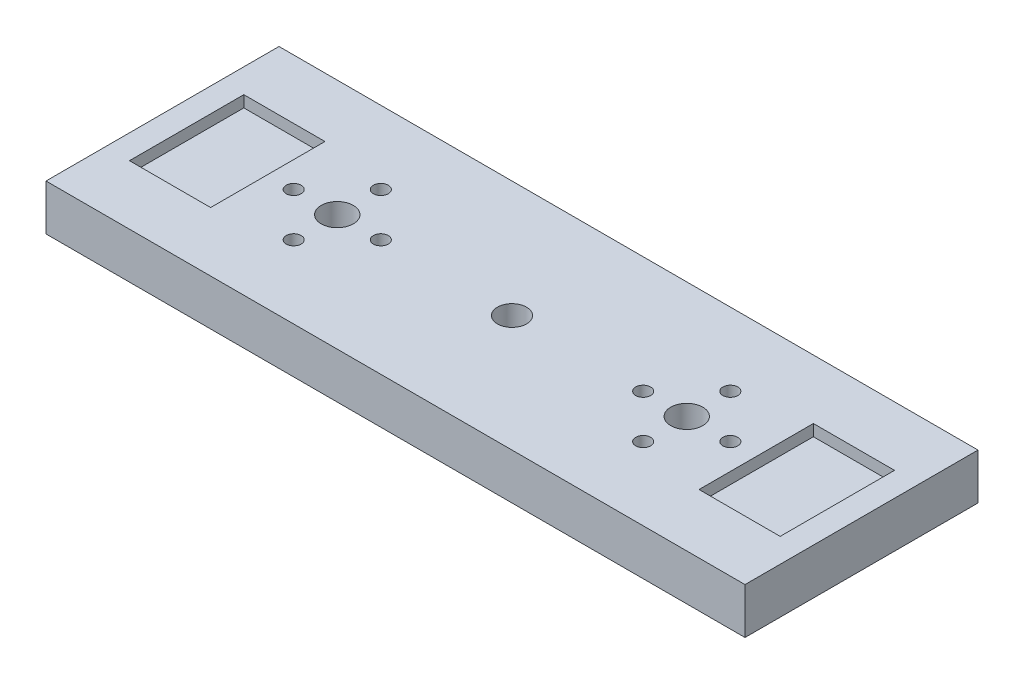
ISO-10303-21;
HEADER;
FILE_DESCRIPTION(('STEP AP214'),'2;1');
FILE_NAME('part.step','',(''),(''),'','','');
FILE_SCHEMA(('AUTOMOTIVE_DESIGN { 1 0 10303 214 1 1 1 1 }'));
ENDSEC;
DATA;
#1=APPLICATION_CONTEXT('core data for automotive mechanical design processes');
#2=APPLICATION_PROTOCOL_DEFINITION('international standard','automotive_design',2000,#1);
#3=PRODUCT_CONTEXT('',#1,'mechanical');
#4=PRODUCT('Part','Part','',(#3));
#5=PRODUCT_RELATED_PRODUCT_CATEGORY('part','',(#4));
#6=PRODUCT_DEFINITION_FORMATION('','',#4);
#7=PRODUCT_DEFINITION_CONTEXT('part definition',#1,'design');
#8=PRODUCT_DEFINITION('design','',#6,#7);
#9=PRODUCT_DEFINITION_SHAPE('','',#8);
#10=(LENGTH_UNIT() NAMED_UNIT(*) SI_UNIT(.MILLI.,.METRE.));
#11=(NAMED_UNIT(*) PLANE_ANGLE_UNIT() SI_UNIT($,.RADIAN.));
#12=(NAMED_UNIT(*) SI_UNIT($,.STERADIAN.) SOLID_ANGLE_UNIT());
#13=UNCERTAINTY_MEASURE_WITH_UNIT(LENGTH_MEASURE(1.E-05),#10,'distance_accuracy_value','');
#14=(GEOMETRIC_REPRESENTATION_CONTEXT(3) GLOBAL_UNCERTAINTY_ASSIGNED_CONTEXT((#13)) GLOBAL_UNIT_ASSIGNED_CONTEXT((#10,
#11,#12)) REPRESENTATION_CONTEXT('',''));
#15=CARTESIAN_POINT('',(0.,0.,0.));
#16=DIRECTION('',(0.,0.,1.));
#17=DIRECTION('',(1.,0.,0.));
#18=AXIS2_PLACEMENT_3D('',#15,#16,#17);
#19=CARTESIAN_POINT('',(0.,20.,0.));
#20=DIRECTION('',(0.,-1.,0.));
#21=DIRECTION('',(0.,0.,-1.));
#22=AXIS2_PLACEMENT_3D('',#19,#20,#21);
#23=PLANE('',#22);
#24=DIRECTION('',(-1.,0.,0.));
#25=VECTOR('',#24,1.);
#26=CARTESIAN_POINT('',(-141.872747828416,20.,-24.9322856161047));
#27=LINE('',#26,#25);
#28=CARTESIAN_POINT('',(-106.484987599106,20.,-24.9322856161047));
#29=VERTEX_POINT('',#28);
#30=CARTESIAN_POINT('',(-141.872747828416,20.,-24.9322856161047));
#31=VERTEX_POINT('',#30);
#32=EDGE_CURVE('E177',#29,#31,#27,.T.);
#33=ORIENTED_EDGE('',*,*,#32,.F.);
#34=DIRECTION('',(0.,0.,-1.));
#35=VECTOR('',#34,1.);
#36=CARTESIAN_POINT('',(-106.484987599106,20.,-24.9322856161047));
#37=LINE('',#36,#35);
#38=CARTESIAN_POINT('',(-106.484987599106,20.,24.9322856161047));
#39=VERTEX_POINT('',#38);
#40=EDGE_CURVE('E68',#39,#29,#37,.T.);
#41=ORIENTED_EDGE('',*,*,#40,.F.);
#42=DIRECTION('',(1.,0.,0.));
#43=VECTOR('',#42,1.);
#44=CARTESIAN_POINT('',(-141.872747828416,20.,24.9322856161047));
#45=LINE('',#44,#43);
#46=CARTESIAN_POINT('',(-141.872747828416,20.,24.9322856161047));
#47=VERTEX_POINT('',#46);
#48=EDGE_CURVE('E165',#47,#39,#45,.T.);
#49=ORIENTED_EDGE('',*,*,#48,.F.);
#50=DIRECTION('',(0.,0.,1.));
#51=VECTOR('',#50,1.);
#52=CARTESIAN_POINT('',(-141.872747828416,20.,-24.9322856161047));
#53=LINE('',#52,#51);
#54=EDGE_CURVE('E169',#31,#47,#53,.T.);
#55=ORIENTED_EDGE('',*,*,#54,.F.);
#56=EDGE_LOOP('',(#33,#41,#49,#55));
#57=FACE_BOUND('',#56,.T.);
#58=DIRECTION('',(0.,0.,1.));
#59=VECTOR('',#58,1.);
#60=CARTESIAN_POINT('',(106.484987599106,20.,-24.9322856161047));
#61=LINE('',#60,#59);
#62=CARTESIAN_POINT('',(106.484987599106,20.,-24.9322856161047));
#63=VERTEX_POINT('',#62);
#64=CARTESIAN_POINT('',(106.484987599106,20.,24.9322856161047));
#65=VERTEX_POINT('',#64);
#66=EDGE_CURVE('E215',#63,#65,#61,.T.);
#67=ORIENTED_EDGE('',*,*,#66,.F.);
#68=DIRECTION('',(-1.,0.,0.));
#69=VECTOR('',#68,1.);
#70=CARTESIAN_POINT('',(141.872747828416,20.,-24.9322856161047));
#71=LINE('',#70,#69);
#72=CARTESIAN_POINT('',(141.872747828416,20.,-24.9322856161047));
#73=VERTEX_POINT('',#72);
#74=EDGE_CURVE('E76',#73,#63,#71,.T.);
#75=ORIENTED_EDGE('',*,*,#74,.F.);
#76=DIRECTION('',(0.,0.,-1.));
#77=VECTOR('',#76,1.);
#78=CARTESIAN_POINT('',(141.872747828416,20.,-24.9322856161047));
#79=LINE('',#78,#77);
#80=CARTESIAN_POINT('',(141.872747828416,20.,24.9322856161047));
#81=VERTEX_POINT('',#80);
#82=EDGE_CURVE('E206',#81,#73,#79,.T.);
#83=ORIENTED_EDGE('',*,*,#82,.F.);
#84=DIRECTION('',(1.,0.,0.));
#85=VECTOR('',#84,1.);
#86=CARTESIAN_POINT('',(141.872747828416,20.,24.9322856161047));
#87=LINE('',#86,#85);
#88=EDGE_CURVE('E210',#65,#81,#87,.T.);
#89=ORIENTED_EDGE('',*,*,#88,.F.);
#90=EDGE_LOOP('',(#67,#75,#83,#89));
#91=FACE_BOUND('',#90,.T.);
#92=CARTESIAN_POINT('',(76.2,20.,-19.));
#93=DIRECTION('',(0.,1.,0.));
#94=DIRECTION('',(0.,0.,1.));
#95=AXIS2_PLACEMENT_3D('',#92,#93,#94);
#96=CIRCLE('',#95,3.25000000000001);
#97=CARTESIAN_POINT('',(76.2,20.,-15.75));
#98=VERTEX_POINT('',#97);
#99=EDGE_CURVE('E241',#98,#98,#96,.T.);
#100=ORIENTED_EDGE('',*,*,#99,.F.);
#101=EDGE_LOOP('',(#100));
#102=FACE_BOUND('',#101,.T.);
#103=CARTESIAN_POINT('',(57.2,20.,0.));
#104=DIRECTION('',(0.,1.,0.));
#105=DIRECTION('',(1.,0.,0.));
#106=AXIS2_PLACEMENT_3D('',#103,#104,#105);
#107=CIRCLE('',#106,3.25000000000001);
#108=CARTESIAN_POINT('',(60.45,20.,0.));
#109=VERTEX_POINT('',#108);
#110=EDGE_CURVE('E667',#109,#109,#107,.T.);
#111=ORIENTED_EDGE('',*,*,#110,.F.);
#112=EDGE_LOOP('',(#111));
#113=FACE_BOUND('',#112,.T.);
#114=CARTESIAN_POINT('',(76.2,20.,19.));
#115=DIRECTION('',(0.,1.,0.));
#116=DIRECTION('',(0.,0.,-1.));
#117=AXIS2_PLACEMENT_3D('',#114,#115,#116);
#118=CIRCLE('',#117,3.25000000000001);
#119=CARTESIAN_POINT('',(76.2,20.,15.75));
#120=VERTEX_POINT('',#119);
#121=EDGE_CURVE('E671',#120,#120,#118,.T.);
#122=ORIENTED_EDGE('',*,*,#121,.F.);
#123=EDGE_LOOP('',(#122));
#124=FACE_BOUND('',#123,.T.);
#125=CARTESIAN_POINT('',(95.2,20.,-2.35922392732846E-13));
#126=DIRECTION('',(0.,1.,0.));
#127=DIRECTION('',(-1.,0.,0.));
#128=AXIS2_PLACEMENT_3D('',#125,#126,#127);
#129=CIRCLE('',#128,3.25000000000001);
#130=CARTESIAN_POINT('',(91.95,20.,-2.01880449679125E-13));
#131=VERTEX_POINT('',#130);
#132=EDGE_CURVE('E187',#131,#131,#129,.T.);
#133=ORIENTED_EDGE('',*,*,#132,.F.);
#134=EDGE_LOOP('',(#133));
#135=FACE_BOUND('',#134,.T.);
#136=CARTESIAN_POINT('',(-95.2,20.,0.));
#137=DIRECTION('',(0.,1.,0.));
#138=DIRECTION('',(1.,0.,0.));
#139=AXIS2_PLACEMENT_3D('',#136,#137,#138);
#140=CIRCLE('',#139,3.25000000000001);
#141=CARTESIAN_POINT('',(-91.95,20.,0.));
#142=VERTEX_POINT('',#141);
#143=EDGE_CURVE('E678',#142,#142,#140,.T.);
#144=ORIENTED_EDGE('',*,*,#143,.F.);
#145=EDGE_LOOP('',(#144));
#146=FACE_BOUND('',#145,.T.);
#147=CARTESIAN_POINT('',(-76.2,20.,19.));
#148=DIRECTION('',(0.,1.,0.));
#149=DIRECTION('',(0.,0.,-1.));
#150=AXIS2_PLACEMENT_3D('',#147,#148,#149);
#151=CIRCLE('',#150,3.25000000000001);
#152=CARTESIAN_POINT('',(-76.2,20.,15.75));
#153=VERTEX_POINT('',#152);
#154=EDGE_CURVE('E367',#153,#153,#151,.T.);
#155=ORIENTED_EDGE('',*,*,#154,.F.);
#156=EDGE_LOOP('',(#155));
#157=FACE_BOUND('',#156,.T.);
#158=CARTESIAN_POINT('',(-57.2,20.,-2.08166817117217E-13));
#159=DIRECTION('',(0.,1.,0.));
#160=DIRECTION('',(-1.,0.,0.));
#161=AXIS2_PLACEMENT_3D('',#158,#159,#160);
#162=CIRCLE('',#161,3.25000000000001);
#163=CARTESIAN_POINT('',(-60.45,20.,-1.74124874063496E-13));
#164=VERTEX_POINT('',#163);
#165=EDGE_CURVE('E240',#164,#164,#162,.T.);
#166=ORIENTED_EDGE('',*,*,#165,.F.);
#167=EDGE_LOOP('',(#166));
#168=FACE_BOUND('',#167,.T.);
#169=CARTESIAN_POINT('',(-76.2,20.,-19.));
#170=DIRECTION('',(0.,1.,0.));
#171=DIRECTION('',(0.,0.,1.));
#172=AXIS2_PLACEMENT_3D('',#169,#170,#171);
#173=CIRCLE('',#172,3.25000000000001);
#174=CARTESIAN_POINT('',(-76.2,20.,-15.75));
#175=VERTEX_POINT('',#174);
#176=EDGE_CURVE('E395',#175,#175,#173,.T.);
#177=ORIENTED_EDGE('',*,*,#176,.F.);
#178=EDGE_LOOP('',(#177));
#179=FACE_BOUND('',#178,.T.);
#180=DIRECTION('',(0.,0.,1.));
#181=VECTOR('',#180,1.);
#182=CARTESIAN_POINT('',(-152.4,20.,-50.8));
#183=LINE('',#182,#181);
#184=CARTESIAN_POINT('',(-152.4,20.,-50.8));
#185=VERTEX_POINT('',#184);
#186=CARTESIAN_POINT('',(-152.4,20.,50.8));
#187=VERTEX_POINT('',#186);
#188=EDGE_CURVE('E256',#185,#187,#183,.T.);
#189=ORIENTED_EDGE('',*,*,#188,.T.);
#190=DIRECTION('',(1.,0.,0.));
#191=VECTOR('',#190,1.);
#192=CARTESIAN_POINT('',(152.4,20.,50.8));
#193=LINE('',#192,#191);
#194=CARTESIAN_POINT('',(152.4,20.,50.8));
#195=VERTEX_POINT('',#194);
#196=EDGE_CURVE('E298',#187,#195,#193,.T.);
#197=ORIENTED_EDGE('',*,*,#196,.T.);
#198=DIRECTION('',(0.,0.,-1.));
#199=VECTOR('',#198,1.);
#200=CARTESIAN_POINT('',(152.4,20.,-50.8));
#201=LINE('',#200,#199);
#202=CARTESIAN_POINT('',(152.4,20.,-50.8));
#203=VERTEX_POINT('',#202);
#204=EDGE_CURVE('E275',#195,#203,#201,.T.);
#205=ORIENTED_EDGE('',*,*,#204,.T.);
#206=DIRECTION('',(-1.,0.,0.));
#207=VECTOR('',#206,1.);
#208=CARTESIAN_POINT('',(152.4,20.,-50.8));
#209=LINE('',#208,#207);
#210=EDGE_CURVE('E264',#203,#185,#209,.T.);
#211=ORIENTED_EDGE('',*,*,#210,.T.);
#212=EDGE_LOOP('',(#189,#197,#205,#211));
#213=FACE_BOUND('',#212,.T.);
#214=CARTESIAN_POINT('',(0.,20.,0.));
#215=DIRECTION('',(0.,1.,0.));
#216=DIRECTION('',(0.,0.,1.));
#217=AXIS2_PLACEMENT_3D('',#214,#215,#216);
#218=CIRCLE('',#217,6.35);
#219=CARTESIAN_POINT('',(0.,20.,6.34999999999999));
#220=VERTEX_POINT('',#219);
#221=EDGE_CURVE('E288',#220,#220,#218,.T.);
#222=ORIENTED_EDGE('',*,*,#221,.F.);
#223=EDGE_LOOP('',(#222));
#224=FACE_BOUND('',#223,.T.);
#225=CARTESIAN_POINT('',(-76.2,20.,0.));
#226=DIRECTION('',(0.,1.,0.));
#227=DIRECTION('',(0.,0.,1.));
#228=AXIS2_PLACEMENT_3D('',#225,#226,#227);
#229=CIRCLE('',#228,7.);
#230=CARTESIAN_POINT('',(-76.2,20.,6.99999999999998));
#231=VERTEX_POINT('',#230);
#232=EDGE_CURVE('E354',#231,#231,#229,.T.);
#233=ORIENTED_EDGE('',*,*,#232,.F.);
#234=EDGE_LOOP('',(#233));
#235=FACE_BOUND('',#234,.T.);
#236=CARTESIAN_POINT('',(76.2,20.,0.));
#237=DIRECTION('',(0.,1.,0.));
#238=DIRECTION('',(0.,0.,1.));
#239=AXIS2_PLACEMENT_3D('',#236,#237,#238);
#240=CIRCLE('',#239,7.);
#241=CARTESIAN_POINT('',(76.2,20.,6.99999999999999));
#242=VERTEX_POINT('',#241);
#243=EDGE_CURVE('E401',#242,#242,#240,.T.);
#244=ORIENTED_EDGE('',*,*,#243,.F.);
#245=EDGE_LOOP('',(#244));
#246=FACE_BOUND('',#245,.T.);
#247=ADVANCED_FACE('F52',(#57,#91,#102,#113,#124,#135,#146,#157,#168,#179,#213,#224,#235,#246),
#23,.F.);
#248=CARTESIAN_POINT('',(0.,0.,0.));
#249=DIRECTION('',(0.,-1.,0.));
#250=DIRECTION('',(0.,0.,-1.));
#251=AXIS2_PLACEMENT_3D('',#248,#249,#250);
#252=PLANE('',#251);
#253=CARTESIAN_POINT('',(76.2,0.,-19.));
#254=DIRECTION('',(0.,1.,0.));
#255=DIRECTION('',(0.,0.,1.));
#256=AXIS2_PLACEMENT_3D('',#253,#254,#255);
#257=CIRCLE('',#256,3.25000000000001);
#258=CARTESIAN_POINT('',(76.2,0.,-15.75));
#259=VERTEX_POINT('',#258);
#260=EDGE_CURVE('E235',#259,#259,#257,.T.);
#261=ORIENTED_EDGE('',*,*,#260,.T.);
#262=EDGE_LOOP('',(#261));
#263=FACE_BOUND('',#262,.T.);
#264=CARTESIAN_POINT('',(57.2,0.,0.));
#265=DIRECTION('',(0.,1.,0.));
#266=DIRECTION('',(1.,0.,0.));
#267=AXIS2_PLACEMENT_3D('',#264,#265,#266);
#268=CIRCLE('',#267,3.25000000000001);
#269=CARTESIAN_POINT('',(60.45,0.,0.));
#270=VERTEX_POINT('',#269);
#271=EDGE_CURVE('E690',#270,#270,#268,.T.);
#272=ORIENTED_EDGE('',*,*,#271,.T.);
#273=EDGE_LOOP('',(#272));
#274=FACE_BOUND('',#273,.T.);
#275=CARTESIAN_POINT('',(76.2,0.,19.));
#276=DIRECTION('',(0.,1.,0.));
#277=DIRECTION('',(0.,0.,-1.));
#278=AXIS2_PLACEMENT_3D('',#275,#276,#277);
#279=CIRCLE('',#278,3.25000000000001);
#280=CARTESIAN_POINT('',(76.2,0.,15.75));
#281=VERTEX_POINT('',#280);
#282=EDGE_CURVE('E694',#281,#281,#279,.T.);
#283=ORIENTED_EDGE('',*,*,#282,.T.);
#284=EDGE_LOOP('',(#283));
#285=FACE_BOUND('',#284,.T.);
#286=CARTESIAN_POINT('',(95.2,0.,-2.35922392732846E-13));
#287=DIRECTION('',(0.,1.,0.));
#288=DIRECTION('',(-1.,0.,0.));
#289=AXIS2_PLACEMENT_3D('',#286,#287,#288);
#290=CIRCLE('',#289,3.25000000000001);
#291=CARTESIAN_POINT('',(91.95,0.,-2.01880449679125E-13));
#292=VERTEX_POINT('',#291);
#293=EDGE_CURVE('E700',#292,#292,#290,.T.);
#294=ORIENTED_EDGE('',*,*,#293,.T.);
#295=EDGE_LOOP('',(#294));
#296=FACE_BOUND('',#295,.T.);
#297=CARTESIAN_POINT('',(-95.2,0.,0.));
#298=DIRECTION('',(0.,1.,0.));
#299=DIRECTION('',(1.,0.,0.));
#300=AXIS2_PLACEMENT_3D('',#297,#298,#299);
#301=CIRCLE('',#300,3.25000000000001);
#302=CARTESIAN_POINT('',(-91.95,0.,0.));
#303=VERTEX_POINT('',#302);
#304=EDGE_CURVE('E400',#303,#303,#301,.T.);
#305=ORIENTED_EDGE('',*,*,#304,.T.);
#306=EDGE_LOOP('',(#305));
#307=FACE_BOUND('',#306,.T.);
#308=CARTESIAN_POINT('',(-76.2,0.,19.));
#309=DIRECTION('',(0.,1.,0.));
#310=DIRECTION('',(0.,0.,-1.));
#311=AXIS2_PLACEMENT_3D('',#308,#309,#310);
#312=CIRCLE('',#311,3.25000000000001);
#313=CARTESIAN_POINT('',(-76.2,0.,15.75));
#314=VERTEX_POINT('',#313);
#315=EDGE_CURVE('E373',#314,#314,#312,.T.);
#316=ORIENTED_EDGE('',*,*,#315,.T.);
#317=EDGE_LOOP('',(#316));
#318=FACE_BOUND('',#317,.T.);
#319=CARTESIAN_POINT('',(-57.2,0.,-2.08166817117217E-13));
#320=DIRECTION('',(0.,1.,0.));
#321=DIRECTION('',(-1.,0.,0.));
#322=AXIS2_PLACEMENT_3D('',#319,#320,#321);
#323=CIRCLE('',#322,3.25000000000001);
#324=CARTESIAN_POINT('',(-60.45,0.,-1.74124874063496E-13));
#325=VERTEX_POINT('',#324);
#326=EDGE_CURVE('E374',#325,#325,#323,.T.);
#327=ORIENTED_EDGE('',*,*,#326,.T.);
#328=EDGE_LOOP('',(#327));
#329=FACE_BOUND('',#328,.T.);
#330=CARTESIAN_POINT('',(-76.2,0.,-19.));
#331=DIRECTION('',(0.,1.,0.));
#332=DIRECTION('',(0.,0.,1.));
#333=AXIS2_PLACEMENT_3D('',#330,#331,#332);
#334=CIRCLE('',#333,3.25000000000001);
#335=CARTESIAN_POINT('',(-76.2,0.,-15.75));
#336=VERTEX_POINT('',#335);
#337=EDGE_CURVE('E390',#336,#336,#334,.T.);
#338=ORIENTED_EDGE('',*,*,#337,.T.);
#339=EDGE_LOOP('',(#338));
#340=FACE_BOUND('',#339,.T.);
#341=CARTESIAN_POINT('',(-76.2,0.,0.));
#342=DIRECTION('',(0.,1.,0.));
#343=DIRECTION('',(0.,0.,1.));
#344=AXIS2_PLACEMENT_3D('',#341,#342,#343);
#345=CIRCLE('',#344,7.);
#346=CARTESIAN_POINT('',(-76.2,0.,6.99999999999998));
#347=VERTEX_POINT('',#346);
#348=EDGE_CURVE('E359',#347,#347,#345,.T.);
#349=ORIENTED_EDGE('',*,*,#348,.T.);
#350=EDGE_LOOP('',(#349));
#351=FACE_BOUND('',#350,.T.);
#352=DIRECTION('',(0.,0.,1.));
#353=VECTOR('',#352,1.);
#354=CARTESIAN_POINT('',(-152.4,0.,-50.8));
#355=LINE('',#354,#353);
#356=CARTESIAN_POINT('',(-152.4,0.,-50.8));
#357=VERTEX_POINT('',#356);
#358=CARTESIAN_POINT('',(-152.4,0.,50.8));
#359=VERTEX_POINT('',#358);
#360=EDGE_CURVE('E285',#357,#359,#355,.T.);
#361=ORIENTED_EDGE('',*,*,#360,.F.);
#362=DIRECTION('',(-1.,0.,0.));
#363=VECTOR('',#362,1.);
#364=CARTESIAN_POINT('',(152.4,0.,-50.8));
#365=LINE('',#364,#363);
#366=CARTESIAN_POINT('',(152.4,0.,-50.8));
#367=VERTEX_POINT('',#366);
#368=EDGE_CURVE('E251',#367,#357,#365,.T.);
#369=ORIENTED_EDGE('',*,*,#368,.F.);
#370=DIRECTION('',(0.,0.,-1.));
#371=VECTOR('',#370,1.);
#372=CARTESIAN_POINT('',(152.4,0.,-50.8));
#373=LINE('',#372,#371);
#374=CARTESIAN_POINT('',(152.4,0.,50.8));
#375=VERTEX_POINT('',#374);
#376=EDGE_CURVE('E257',#375,#367,#373,.T.);
#377=ORIENTED_EDGE('',*,*,#376,.F.);
#378=DIRECTION('',(1.,0.,0.));
#379=VECTOR('',#378,1.);
#380=CARTESIAN_POINT('',(152.4,0.,50.8));
#381=LINE('',#380,#379);
#382=EDGE_CURVE('E282',#359,#375,#381,.T.);
#383=ORIENTED_EDGE('',*,*,#382,.F.);
#384=EDGE_LOOP('',(#361,#369,#377,#383));
#385=FACE_BOUND('',#384,.T.);
#386=CARTESIAN_POINT('',(0.,0.,0.));
#387=DIRECTION('',(0.,1.,0.));
#388=DIRECTION('',(0.,0.,1.));
#389=AXIS2_PLACEMENT_3D('',#386,#387,#388);
#390=CIRCLE('',#389,6.35);
#391=CARTESIAN_POINT('',(0.,0.,6.34999999999999));
#392=VERTEX_POINT('',#391);
#393=EDGE_CURVE('E352',#392,#392,#390,.T.);
#394=ORIENTED_EDGE('',*,*,#393,.T.);
#395=EDGE_LOOP('',(#394));
#396=FACE_BOUND('',#395,.T.);
#397=CARTESIAN_POINT('',(76.2,0.,0.));
#398=DIRECTION('',(0.,1.,0.));
#399=DIRECTION('',(0.,0.,1.));
#400=AXIS2_PLACEMENT_3D('',#397,#398,#399);
#401=CIRCLE('',#400,7.);
#402=CARTESIAN_POINT('',(76.2,0.,6.99999999999999));
#403=VERTEX_POINT('',#402);
#404=EDGE_CURVE('E394',#403,#403,#401,.T.);
#405=ORIENTED_EDGE('',*,*,#404,.T.);
#406=EDGE_LOOP('',(#405));
#407=FACE_BOUND('',#406,.T.);
#408=ADVANCED_FACE('F280',(#263,#274,#285,#296,#307,#318,#329,#340,#351,#385,#396,#407),#252,.T.);
#409=CARTESIAN_POINT('',(-152.4,20.,-50.8));
#410=DIRECTION('',(1.,0.,0.));
#411=DIRECTION('',(0.,0.,-1.));
#412=AXIS2_PLACEMENT_3D('',#409,#410,#411);
#413=PLANE('',#412);
#414=ORIENTED_EDGE('',*,*,#360,.T.);
#415=DIRECTION('',(0.,-1.,0.));
#416=VECTOR('',#415,1.);
#417=CARTESIAN_POINT('',(-152.4,20.,50.8));
#418=LINE('',#417,#416);
#419=EDGE_CURVE('E12',#187,#359,#418,.T.);
#420=ORIENTED_EDGE('',*,*,#419,.F.);
#421=ORIENTED_EDGE('',*,*,#188,.F.);
#422=DIRECTION('',(0.,-1.,0.));
#423=VECTOR('',#422,1.);
#424=CARTESIAN_POINT('',(-152.4,20.,-50.8));
#425=LINE('',#424,#423);
#426=EDGE_CURVE('E259',#185,#357,#425,.T.);
#427=ORIENTED_EDGE('',*,*,#426,.T.);
#428=EDGE_LOOP('',(#414,#420,#421,#427));
#429=FACE_BOUND('',#428,.T.);
#430=ADVANCED_FACE('F54',(#429),#413,.F.);
#431=CARTESIAN_POINT('',(152.4,20.,50.8));
#432=DIRECTION('',(0.,0.,-1.));
#433=DIRECTION('',(-1.,0.,0.));
#434=AXIS2_PLACEMENT_3D('',#431,#432,#433);
#435=PLANE('',#434);
#436=ORIENTED_EDGE('',*,*,#382,.T.);
#437=DIRECTION('',(0.,-1.,0.));
#438=VECTOR('',#437,1.);
#439=CARTESIAN_POINT('',(152.4,20.,50.8));
#440=LINE('',#439,#438);
#441=EDGE_CURVE('E61',#195,#375,#440,.T.);
#442=ORIENTED_EDGE('',*,*,#441,.F.);
#443=ORIENTED_EDGE('',*,*,#196,.F.);
#444=ORIENTED_EDGE('',*,*,#419,.T.);
#445=EDGE_LOOP('',(#436,#442,#443,#444));
#446=FACE_BOUND('',#445,.T.);
#447=ADVANCED_FACE('F318',(#446),#435,.F.);
#448=CARTESIAN_POINT('',(152.4,20.,-50.8));
#449=DIRECTION('',(-1.,0.,0.));
#450=DIRECTION('',(0.,0.,1.));
#451=AXIS2_PLACEMENT_3D('',#448,#449,#450);
#452=PLANE('',#451);
#453=ORIENTED_EDGE('',*,*,#376,.T.);
#454=DIRECTION('',(0.,-1.,0.));
#455=VECTOR('',#454,1.);
#456=CARTESIAN_POINT('',(152.4,20.,-50.8));
#457=LINE('',#456,#455);
#458=EDGE_CURVE('E263',#203,#367,#457,.T.);
#459=ORIENTED_EDGE('',*,*,#458,.F.);
#460=ORIENTED_EDGE('',*,*,#204,.F.);
#461=ORIENTED_EDGE('',*,*,#441,.T.);
#462=EDGE_LOOP('',(#453,#459,#460,#461));
#463=FACE_BOUND('',#462,.T.);
#464=ADVANCED_FACE('F273',(#463),#452,.F.);
#465=CARTESIAN_POINT('',(152.4,20.,-50.8));
#466=DIRECTION('',(0.,0.,1.));
#467=DIRECTION('',(1.,0.,0.));
#468=AXIS2_PLACEMENT_3D('',#465,#466,#467);
#469=PLANE('',#468);
#470=ORIENTED_EDGE('',*,*,#368,.T.);
#471=ORIENTED_EDGE('',*,*,#426,.F.);
#472=ORIENTED_EDGE('',*,*,#210,.F.);
#473=ORIENTED_EDGE('',*,*,#458,.T.);
#474=EDGE_LOOP('',(#470,#471,#472,#473));
#475=FACE_BOUND('',#474,.T.);
#476=ADVANCED_FACE('F315',(#475),#469,.F.);
#477=CARTESIAN_POINT('',(0.,20.,0.));
#478=DIRECTION('',(0.,-1.,0.));
#479=DIRECTION('',(0.,0.,-1.));
#480=AXIS2_PLACEMENT_3D('',#477,#478,#479);
#481=CYLINDRICAL_SURFACE('',#480,6.35);
#482=ORIENTED_EDGE('',*,*,#221,.T.);
#483=EDGE_LOOP('',(#482));
#484=FACE_BOUND('',#483,.T.);
#485=ORIENTED_EDGE('',*,*,#393,.F.);
#486=EDGE_LOOP('',(#485));
#487=FACE_BOUND('',#486,.T.);
#488=ADVANCED_FACE('F333',(#484,#487),#481,.F.);
#489=CARTESIAN_POINT('',(-76.2,20.,0.));
#490=DIRECTION('',(0.,-1.,0.));
#491=DIRECTION('',(0.,0.,-1.));
#492=AXIS2_PLACEMENT_3D('',#489,#490,#491);
#493=CYLINDRICAL_SURFACE('',#492,7.);
#494=ORIENTED_EDGE('',*,*,#232,.T.);
#495=EDGE_LOOP('',(#494));
#496=FACE_BOUND('',#495,.T.);
#497=ORIENTED_EDGE('',*,*,#348,.F.);
#498=EDGE_LOOP('',(#497));
#499=FACE_BOUND('',#498,.T.);
#500=ADVANCED_FACE('F340',(#496,#499),#493,.F.);
#501=CARTESIAN_POINT('',(76.2,20.,0.));
#502=DIRECTION('',(0.,-1.,0.));
#503=DIRECTION('',(0.,0.,-1.));
#504=AXIS2_PLACEMENT_3D('',#501,#502,#503);
#505=CYLINDRICAL_SURFACE('',#504,7.);
#506=ORIENTED_EDGE('',*,*,#243,.T.);
#507=EDGE_LOOP('',(#506));
#508=FACE_BOUND('',#507,.T.);
#509=ORIENTED_EDGE('',*,*,#404,.F.);
#510=EDGE_LOOP('',(#509));
#511=FACE_BOUND('',#510,.T.);
#512=ADVANCED_FACE('F345',(#508,#511),#505,.F.);
#513=CARTESIAN_POINT('',(-76.2,0.,-19.));
#514=DIRECTION('',(0.,1.,0.));
#515=DIRECTION('',(0.,0.,1.));
#516=AXIS2_PLACEMENT_3D('',#513,#514,#515);
#517=CYLINDRICAL_SURFACE('',#516,3.25000000000001);
#518=ORIENTED_EDGE('',*,*,#337,.F.);
#519=EDGE_LOOP('',(#518));
#520=FACE_BOUND('',#519,.T.);
#521=ORIENTED_EDGE('',*,*,#176,.T.);
#522=EDGE_LOOP('',(#521));
#523=FACE_BOUND('',#522,.T.);
#524=ADVANCED_FACE('F411',(#520,#523),#517,.F.);
#525=CARTESIAN_POINT('',(-57.2,0.,-2.08166817117217E-13));
#526=DIRECTION('',(0.,1.,0.));
#527=DIRECTION('',(0.,0.,1.));
#528=AXIS2_PLACEMENT_3D('',#525,#526,#527);
#529=CYLINDRICAL_SURFACE('',#528,3.25000000000001);
#530=ORIENTED_EDGE('',*,*,#326,.F.);
#531=EDGE_LOOP('',(#530));
#532=FACE_BOUND('',#531,.T.);
#533=ORIENTED_EDGE('',*,*,#165,.T.);
#534=EDGE_LOOP('',(#533));
#535=FACE_BOUND('',#534,.T.);
#536=ADVANCED_FACE('F417',(#532,#535),#529,.F.);
#537=CARTESIAN_POINT('',(-76.2,0.,19.));
#538=DIRECTION('',(0.,1.,0.));
#539=DIRECTION('',(0.,0.,1.));
#540=AXIS2_PLACEMENT_3D('',#537,#538,#539);
#541=CYLINDRICAL_SURFACE('',#540,3.25000000000001);
#542=ORIENTED_EDGE('',*,*,#315,.F.);
#543=EDGE_LOOP('',(#542));
#544=FACE_BOUND('',#543,.T.);
#545=ORIENTED_EDGE('',*,*,#154,.T.);
#546=EDGE_LOOP('',(#545));
#547=FACE_BOUND('',#546,.T.);
#548=ADVANCED_FACE('F423',(#544,#547),#541,.F.);
#549=CARTESIAN_POINT('',(-95.2,0.,0.));
#550=DIRECTION('',(0.,1.,0.));
#551=DIRECTION('',(0.,0.,1.));
#552=AXIS2_PLACEMENT_3D('',#549,#550,#551);
#553=CYLINDRICAL_SURFACE('',#552,3.25000000000001);
#554=ORIENTED_EDGE('',*,*,#304,.F.);
#555=EDGE_LOOP('',(#554));
#556=FACE_BOUND('',#555,.T.);
#557=ORIENTED_EDGE('',*,*,#143,.T.);
#558=EDGE_LOOP('',(#557));
#559=FACE_BOUND('',#558,.T.);
#560=ADVANCED_FACE('F427',(#556,#559),#553,.F.);
#561=CARTESIAN_POINT('',(95.2,0.,-2.35922392732846E-13));
#562=DIRECTION('',(0.,1.,0.));
#563=DIRECTION('',(0.,0.,1.));
#564=AXIS2_PLACEMENT_3D('',#561,#562,#563);
#565=CYLINDRICAL_SURFACE('',#564,3.25000000000001);
#566=ORIENTED_EDGE('',*,*,#293,.F.);
#567=EDGE_LOOP('',(#566));
#568=FACE_BOUND('',#567,.T.);
#569=ORIENTED_EDGE('',*,*,#132,.T.);
#570=EDGE_LOOP('',(#569));
#571=FACE_BOUND('',#570,.T.);
#572=ADVANCED_FACE('F431',(#568,#571),#565,.F.);
#573=CARTESIAN_POINT('',(76.2,0.,19.));
#574=DIRECTION('',(0.,1.,0.));
#575=DIRECTION('',(0.,0.,1.));
#576=AXIS2_PLACEMENT_3D('',#573,#574,#575);
#577=CYLINDRICAL_SURFACE('',#576,3.25000000000001);
#578=ORIENTED_EDGE('',*,*,#282,.F.);
#579=EDGE_LOOP('',(#578));
#580=FACE_BOUND('',#579,.T.);
#581=ORIENTED_EDGE('',*,*,#121,.T.);
#582=EDGE_LOOP('',(#581));
#583=FACE_BOUND('',#582,.T.);
#584=ADVANCED_FACE('F434',(#580,#583),#577,.F.);
#585=CARTESIAN_POINT('',(57.2,0.,0.));
#586=DIRECTION('',(0.,1.,0.));
#587=DIRECTION('',(0.,0.,1.));
#588=AXIS2_PLACEMENT_3D('',#585,#586,#587);
#589=CYLINDRICAL_SURFACE('',#588,3.25000000000001);
#590=ORIENTED_EDGE('',*,*,#271,.F.);
#591=EDGE_LOOP('',(#590));
#592=FACE_BOUND('',#591,.T.);
#593=ORIENTED_EDGE('',*,*,#110,.T.);
#594=EDGE_LOOP('',(#593));
#595=FACE_BOUND('',#594,.T.);
#596=ADVANCED_FACE('F438',(#592,#595),#589,.F.);
#597=CARTESIAN_POINT('',(76.2,0.,-19.));
#598=DIRECTION('',(0.,1.,0.));
#599=DIRECTION('',(0.,0.,1.));
#600=AXIS2_PLACEMENT_3D('',#597,#598,#599);
#601=CYLINDRICAL_SURFACE('',#600,3.25000000000001);
#602=ORIENTED_EDGE('',*,*,#260,.F.);
#603=EDGE_LOOP('',(#602));
#604=FACE_BOUND('',#603,.T.);
#605=ORIENTED_EDGE('',*,*,#99,.T.);
#606=EDGE_LOOP('',(#605));
#607=FACE_BOUND('',#606,.T.);
#608=ADVANCED_FACE('F442',(#604,#607),#601,.F.);
#609=CARTESIAN_POINT('',(141.872747828416,15.,-24.9322856161047));
#610=DIRECTION('',(0.,0.,-1.));
#611=DIRECTION('',(-1.,0.,0.));
#612=AXIS2_PLACEMENT_3D('',#609,#610,#611);
#613=PLANE('',#612);
#614=ORIENTED_EDGE('',*,*,#74,.T.);
#615=DIRECTION('',(0.,1.,0.));
#616=VECTOR('',#615,1.);
#617=CARTESIAN_POINT('',(106.484987599106,15.,-24.9322856161047));
#618=LINE('',#617,#616);
#619=CARTESIAN_POINT('',(106.484987599106,15.,-24.9322856161047));
#620=VERTEX_POINT('',#619);
#621=EDGE_CURVE('E193',#620,#63,#618,.T.);
#622=ORIENTED_EDGE('',*,*,#621,.F.);
#623=DIRECTION('',(-1.,0.,0.));
#624=VECTOR('',#623,1.);
#625=CARTESIAN_POINT('',(141.872747828416,15.,-24.9322856161047));
#626=LINE('',#625,#624);
#627=CARTESIAN_POINT('',(141.872747828416,15.,-24.9322856161047));
#628=VERTEX_POINT('',#627);
#629=EDGE_CURVE('E211',#628,#620,#626,.T.);
#630=ORIENTED_EDGE('',*,*,#629,.F.);
#631=DIRECTION('',(0.,1.,0.));
#632=VECTOR('',#631,1.);
#633=CARTESIAN_POINT('',(141.872747828416,15.,-24.9322856161047));
#634=LINE('',#633,#632);
#635=EDGE_CURVE('E203',#628,#73,#634,.T.);
#636=ORIENTED_EDGE('',*,*,#635,.T.);
#637=EDGE_LOOP('',(#614,#622,#630,#636));
#638=FACE_BOUND('',#637,.T.);
#639=ADVANCED_FACE('F445',(#638),#613,.F.);
#640=CARTESIAN_POINT('',(141.872747828416,15.,-24.9322856161047));
#641=DIRECTION('',(1.,0.,0.));
#642=DIRECTION('',(0.,0.,-1.));
#643=AXIS2_PLACEMENT_3D('',#640,#641,#642);
#644=PLANE('',#643);
#645=ORIENTED_EDGE('',*,*,#82,.T.);
#646=ORIENTED_EDGE('',*,*,#635,.F.);
#647=DIRECTION('',(0.,0.,-1.));
#648=VECTOR('',#647,1.);
#649=CARTESIAN_POINT('',(141.872747828416,15.,-24.9322856161047));
#650=LINE('',#649,#648);
#651=CARTESIAN_POINT('',(141.872747828416,15.,24.9322856161047));
#652=VERTEX_POINT('',#651);
#653=EDGE_CURVE('E196',#652,#628,#650,.T.);
#654=ORIENTED_EDGE('',*,*,#653,.F.);
#655=DIRECTION('',(0.,1.,0.));
#656=VECTOR('',#655,1.);
#657=CARTESIAN_POINT('',(141.872747828416,15.,24.9322856161047));
#658=LINE('',#657,#656);
#659=EDGE_CURVE('E200',#652,#81,#658,.T.);
#660=ORIENTED_EDGE('',*,*,#659,.T.);
#661=EDGE_LOOP('',(#645,#646,#654,#660));
#662=FACE_BOUND('',#661,.T.);
#663=ADVANCED_FACE('F452',(#662),#644,.F.);
#664=CARTESIAN_POINT('',(141.872747828416,15.,24.9322856161047));
#665=DIRECTION('',(0.,0.,1.));
#666=DIRECTION('',(1.,0.,0.));
#667=AXIS2_PLACEMENT_3D('',#664,#665,#666);
#668=PLANE('',#667);
#669=ORIENTED_EDGE('',*,*,#88,.T.);
#670=ORIENTED_EDGE('',*,*,#659,.F.);
#671=DIRECTION('',(1.,0.,0.));
#672=VECTOR('',#671,1.);
#673=CARTESIAN_POINT('',(141.872747828416,15.,24.9322856161047));
#674=LINE('',#673,#672);
#675=CARTESIAN_POINT('',(106.484987599106,15.,24.9322856161047));
#676=VERTEX_POINT('',#675);
#677=EDGE_CURVE('E224',#676,#652,#674,.T.);
#678=ORIENTED_EDGE('',*,*,#677,.F.);
#679=DIRECTION('',(0.,1.,0.));
#680=VECTOR('',#679,1.);
#681=CARTESIAN_POINT('',(106.484987599106,15.,24.9322856161047));
#682=LINE('',#681,#680);
#683=EDGE_CURVE('E197',#676,#65,#682,.T.);
#684=ORIENTED_EDGE('',*,*,#683,.T.);
#685=EDGE_LOOP('',(#669,#670,#678,#684));
#686=FACE_BOUND('',#685,.T.);
#687=ADVANCED_FACE('F455',(#686),#668,.F.);
#688=CARTESIAN_POINT('',(106.484987599106,15.,-24.9322856161047));
#689=DIRECTION('',(-1.,0.,0.));
#690=DIRECTION('',(0.,0.,1.));
#691=AXIS2_PLACEMENT_3D('',#688,#689,#690);
#692=PLANE('',#691);
#693=ORIENTED_EDGE('',*,*,#66,.T.);
#694=ORIENTED_EDGE('',*,*,#683,.F.);
#695=DIRECTION('',(0.,0.,1.));
#696=VECTOR('',#695,1.);
#697=CARTESIAN_POINT('',(106.484987599106,15.,-24.9322856161047));
#698=LINE('',#697,#696);
#699=EDGE_CURVE('E228',#620,#676,#698,.T.);
#700=ORIENTED_EDGE('',*,*,#699,.F.);
#701=ORIENTED_EDGE('',*,*,#621,.T.);
#702=EDGE_LOOP('',(#693,#694,#700,#701));
#703=FACE_BOUND('',#702,.T.);
#704=ADVANCED_FACE('F450',(#703),#692,.F.);
#705=CARTESIAN_POINT('',(0.,15.,0.));
#706=DIRECTION('',(0.,1.,0.));
#707=DIRECTION('',(0.,0.,1.));
#708=AXIS2_PLACEMENT_3D('',#705,#706,#707);
#709=PLANE('',#708);
#710=ORIENTED_EDGE('',*,*,#629,.T.);
#711=ORIENTED_EDGE('',*,*,#699,.T.);
#712=ORIENTED_EDGE('',*,*,#677,.T.);
#713=ORIENTED_EDGE('',*,*,#653,.T.);
#714=EDGE_LOOP('',(#710,#711,#712,#713));
#715=FACE_BOUND('',#714,.T.);
#716=ADVANCED_FACE('F447',(#715),#709,.T.);
#717=CARTESIAN_POINT('',(-106.484987599106,15.,-24.9322856161047));
#718=DIRECTION('',(1.,0.,0.));
#719=DIRECTION('',(0.,0.,-1.));
#720=AXIS2_PLACEMENT_3D('',#717,#718,#719);
#721=PLANE('',#720);
#722=ORIENTED_EDGE('',*,*,#40,.T.);
#723=DIRECTION('',(0.,1.,0.));
#724=VECTOR('',#723,1.);
#725=CARTESIAN_POINT('',(-106.484987599106,15.,-24.9322856161047));
#726=LINE('',#725,#724);
#727=CARTESIAN_POINT('',(-106.484987599106,15.,-24.9322856161047));
#728=VERTEX_POINT('',#727);
#729=EDGE_CURVE('E140',#728,#29,#726,.T.);
#730=ORIENTED_EDGE('',*,*,#729,.F.);
#731=DIRECTION('',(0.,0.,-1.));
#732=VECTOR('',#731,1.);
#733=CARTESIAN_POINT('',(-106.484987599106,15.,-24.9322856161047));
#734=LINE('',#733,#732);
#735=CARTESIAN_POINT('',(-106.484987599106,15.,24.9322856161047));
#736=VERTEX_POINT('',#735);
#737=EDGE_CURVE('E144',#736,#728,#734,.T.);
#738=ORIENTED_EDGE('',*,*,#737,.F.);
#739=DIRECTION('',(0.,1.,0.));
#740=VECTOR('',#739,1.);
#741=CARTESIAN_POINT('',(-106.484987599106,15.,24.9322856161047));
#742=LINE('',#741,#740);
#743=EDGE_CURVE('E184',#736,#39,#742,.T.);
#744=ORIENTED_EDGE('',*,*,#743,.T.);
#745=EDGE_LOOP('',(#722,#730,#738,#744));
#746=FACE_BOUND('',#745,.T.);
#747=ADVANCED_FACE('F142',(#746),#721,.F.);
#748=CARTESIAN_POINT('',(-141.872747828416,15.,24.9322856161047));
#749=DIRECTION('',(0.,0.,1.));
#750=DIRECTION('',(1.,0.,0.));
#751=AXIS2_PLACEMENT_3D('',#748,#749,#750);
#752=PLANE('',#751);
#753=ORIENTED_EDGE('',*,*,#48,.T.);
#754=ORIENTED_EDGE('',*,*,#743,.F.);
#755=DIRECTION('',(1.,0.,0.));
#756=VECTOR('',#755,1.);
#757=CARTESIAN_POINT('',(-141.872747828416,15.,24.9322856161047));
#758=LINE('',#757,#756);
#759=CARTESIAN_POINT('',(-141.872747828416,15.,24.9322856161047));
#760=VERTEX_POINT('',#759);
#761=EDGE_CURVE('E151',#760,#736,#758,.T.);
#762=ORIENTED_EDGE('',*,*,#761,.F.);
#763=DIRECTION('',(0.,1.,0.));
#764=VECTOR('',#763,1.);
#765=CARTESIAN_POINT('',(-141.872747828416,15.,24.9322856161047));
#766=LINE('',#765,#764);
#767=EDGE_CURVE('E188',#760,#47,#766,.T.);
#768=ORIENTED_EDGE('',*,*,#767,.T.);
#769=EDGE_LOOP('',(#753,#754,#762,#768));
#770=FACE_BOUND('',#769,.T.);
#771=ADVANCED_FACE('F467',(#770),#752,.F.);
#772=CARTESIAN_POINT('',(-141.872747828416,15.,-24.9322856161047));
#773=DIRECTION('',(-1.,0.,0.));
#774=DIRECTION('',(0.,0.,1.));
#775=AXIS2_PLACEMENT_3D('',#772,#773,#774);
#776=PLANE('',#775);
#777=ORIENTED_EDGE('',*,*,#54,.T.);
#778=ORIENTED_EDGE('',*,*,#767,.F.);
#779=DIRECTION('',(0.,0.,1.));
#780=VECTOR('',#779,1.);
#781=CARTESIAN_POINT('',(-141.872747828416,15.,-24.9322856161047));
#782=LINE('',#781,#780);
#783=CARTESIAN_POINT('',(-141.872747828416,15.,-24.9322856161047));
#784=VERTEX_POINT('',#783);
#785=EDGE_CURVE('E160',#784,#760,#782,.T.);
#786=ORIENTED_EDGE('',*,*,#785,.F.);
#787=DIRECTION('',(0.,1.,0.));
#788=VECTOR('',#787,1.);
#789=CARTESIAN_POINT('',(-141.872747828416,15.,-24.9322856161047));
#790=LINE('',#789,#788);
#791=EDGE_CURVE('E150',#784,#31,#790,.T.);
#792=ORIENTED_EDGE('',*,*,#791,.T.);
#793=EDGE_LOOP('',(#777,#778,#786,#792));
#794=FACE_BOUND('',#793,.T.);
#795=ADVANCED_FACE('F470',(#794),#776,.F.);
#796=CARTESIAN_POINT('',(-141.872747828416,15.,-24.9322856161047));
#797=DIRECTION('',(0.,0.,-1.));
#798=DIRECTION('',(-1.,0.,0.));
#799=AXIS2_PLACEMENT_3D('',#796,#797,#798);
#800=PLANE('',#799);
#801=ORIENTED_EDGE('',*,*,#32,.T.);
#802=ORIENTED_EDGE('',*,*,#791,.F.);
#803=DIRECTION('',(-1.,0.,0.));
#804=VECTOR('',#803,1.);
#805=CARTESIAN_POINT('',(-141.872747828416,15.,-24.9322856161047));
#806=LINE('',#805,#804);
#807=EDGE_CURVE('E154',#728,#784,#806,.T.);
#808=ORIENTED_EDGE('',*,*,#807,.F.);
#809=ORIENTED_EDGE('',*,*,#729,.T.);
#810=EDGE_LOOP('',(#801,#802,#808,#809));
#811=FACE_BOUND('',#810,.T.);
#812=ADVANCED_FACE('F155',(#811),#800,.F.);
#813=CARTESIAN_POINT('',(0.,15.,0.));
#814=DIRECTION('',(0.,1.,0.));
#815=DIRECTION('',(0.,0.,1.));
#816=AXIS2_PLACEMENT_3D('',#813,#814,#815);
#817=PLANE('',#816);
#818=ORIENTED_EDGE('',*,*,#737,.T.);
#819=ORIENTED_EDGE('',*,*,#807,.T.);
#820=ORIENTED_EDGE('',*,*,#785,.T.);
#821=ORIENTED_EDGE('',*,*,#761,.T.);
#822=EDGE_LOOP('',(#818,#819,#820,#821));
#823=FACE_BOUND('',#822,.T.);
#824=ADVANCED_FACE('F162',(#823),#817,.T.);
#825=CLOSED_SHELL('',(#247,#408,#430,#447,#464,#476,#488,#500,#512,#524,#536,#548,#560,#572,
#584,#596,#608,#639,#663,#687,#704,#716,#747,#771,#795,#812,#824));
#826=MANIFOLD_SOLID_BREP('B2',#825);
#827=ADVANCED_BREP_SHAPE_REPRESENTATION('',(#18,#826),#14);
#828=SHAPE_DEFINITION_REPRESENTATION(#9,#827);
ENDSEC;
END-ISO-10303-21;
